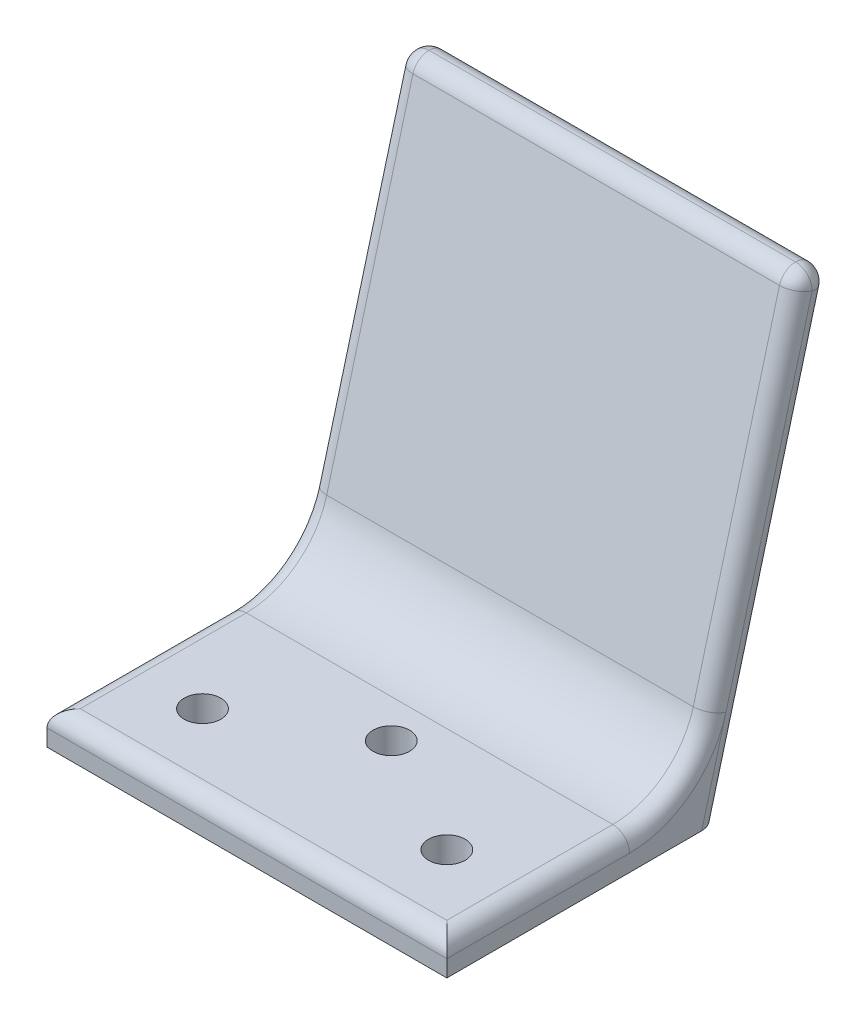
ISO-10303-21;
HEADER;
FILE_DESCRIPTION(('STEP AP214'),'2;1');
FILE_NAME('part.step','',(''),(''),'','','');
FILE_SCHEMA(('AUTOMOTIVE_DESIGN { 1 0 10303 214 1 1 1 1 }'));
ENDSEC;
DATA;
#1=APPLICATION_CONTEXT('core data for automotive mechanical design processes');
#2=APPLICATION_PROTOCOL_DEFINITION('international standard','automotive_design',2000,#1);
#3=PRODUCT_CONTEXT('',#1,'mechanical');
#4=PRODUCT('Part','Part','',(#3));
#5=PRODUCT_RELATED_PRODUCT_CATEGORY('part','',(#4));
#6=PRODUCT_DEFINITION_FORMATION('','',#4);
#7=PRODUCT_DEFINITION_CONTEXT('part definition',#1,'design');
#8=PRODUCT_DEFINITION('design','',#6,#7);
#9=PRODUCT_DEFINITION_SHAPE('','',#8);
#10=(LENGTH_UNIT() NAMED_UNIT(*) SI_UNIT(.MILLI.,.METRE.));
#11=(NAMED_UNIT(*) PLANE_ANGLE_UNIT() SI_UNIT($,.RADIAN.));
#12=(NAMED_UNIT(*) SI_UNIT($,.STERADIAN.) SOLID_ANGLE_UNIT());
#13=UNCERTAINTY_MEASURE_WITH_UNIT(LENGTH_MEASURE(1.E-05),#10,'distance_accuracy_value','');
#14=(GEOMETRIC_REPRESENTATION_CONTEXT(3) GLOBAL_UNCERTAINTY_ASSIGNED_CONTEXT((#13)) GLOBAL_UNIT_ASSIGNED_CONTEXT((#10,
#11,#12)) REPRESENTATION_CONTEXT('',''));
#15=CARTESIAN_POINT('',(0.,0.,0.));
#16=DIRECTION('',(0.,0.,1.));
#17=DIRECTION('',(1.,0.,0.));
#18=AXIS2_PLACEMENT_3D('',#15,#16,#17);
#19=CARTESIAN_POINT('',(-22.5201435218095,73.9492967096611,17.4042615681988));
#20=DIRECTION('',(0.,1.,0.));
#21=DIRECTION('',(0.,0.,1.));
#22=AXIS2_PLACEMENT_3D('',#19,#20,#21);
#23=PLANE('',#22);
#24=CARTESIAN_POINT('',(6.47985647819113,73.9492967096611,10.4042615681988));
#25=DIRECTION('',(0.,1.,0.));
#26=DIRECTION('',(0.,0.,1.));
#27=AXIS2_PLACEMENT_3D('',#24,#25,#26);
#28=CIRCLE('',#27,1.65);
#29=CARTESIAN_POINT('',(6.47985647819113,73.9492967096611,12.0542615681988));
#30=VERTEX_POINT('',#29);
#31=EDGE_CURVE('E529',#30,#30,#28,.F.);
#32=ORIENTED_EDGE('',*,*,#31,.T.);
#33=EDGE_LOOP('',(#32));
#34=FACE_BOUND('',#33,.T.);
#35=DIRECTION('',(1.,0.,0.));
#36=VECTOR('',#35,1.);
#37=CARTESIAN_POINT('',(-22.5201435218095,73.9492967096611,0.961194941977908));
#38=LINE('',#37,#36);
#39=CARTESIAN_POINT('',(11.9798564781905,73.9492967096611,0.961194941977908));
#40=VERTEX_POINT('',#39);
#41=CARTESIAN_POINT('',(-21.0201435218095,73.9492967096611,0.961194941977908));
#42=VERTEX_POINT('',#41);
#43=EDGE_CURVE('E195',#40,#42,#38,.F.);
#44=ORIENTED_EDGE('',*,*,#43,.T.);
#45=DIRECTION('',(0.,0.,1.));
#46=VECTOR('',#45,1.);
#47=CARTESIAN_POINT('',(-21.0201435218095,73.9492967096611,17.4042615681988));
#48=LINE('',#47,#46);
#49=CARTESIAN_POINT('',(-21.0201435218095,73.9492967096611,15.9042615681988));
#50=VERTEX_POINT('',#49);
#51=EDGE_CURVE('E205',#42,#50,#48,.T.);
#52=ORIENTED_EDGE('',*,*,#51,.T.);
#53=DIRECTION('',(1.,0.,0.));
#54=VECTOR('',#53,1.);
#55=CARTESIAN_POINT('',(-22.5201435218095,73.9492967096611,15.9042615681988));
#56=LINE('',#55,#54);
#57=CARTESIAN_POINT('',(11.9798564781905,73.9492967096611,15.9042615681988));
#58=VERTEX_POINT('',#57);
#59=EDGE_CURVE('E199',#50,#58,#56,.T.);
#60=ORIENTED_EDGE('',*,*,#59,.T.);
#61=DIRECTION('',(0.,0.,1.));
#62=VECTOR('',#61,1.);
#63=CARTESIAN_POINT('',(11.9798564781905,73.9492967096611,17.4042615681988));
#64=LINE('',#63,#62);
#65=EDGE_CURVE('E202',#58,#40,#64,.F.);
#66=ORIENTED_EDGE('',*,*,#65,.T.);
#67=EDGE_LOOP('',(#44,#52,#60,#66));
#68=FACE_BOUND('',#67,.T.);
#69=CARTESIAN_POINT('',(-4.52014352180916,73.9492967096611,4.40426156819883));
#70=DIRECTION('',(0.,1.,0.));
#71=DIRECTION('',(0.,0.,1.));
#72=AXIS2_PLACEMENT_3D('',#69,#70,#71);
#73=CIRCLE('',#72,1.65);
#74=CARTESIAN_POINT('',(-4.52014352180916,73.9492967096611,6.05426156819883));
#75=VERTEX_POINT('',#74);
#76=EDGE_CURVE('E520',#75,#75,#73,.T.);
#77=ORIENTED_EDGE('',*,*,#76,.F.);
#78=EDGE_LOOP('',(#77));
#79=FACE_BOUND('',#78,.T.);
#80=CARTESIAN_POINT('',(-15.5201435218095,73.9492967096611,10.4042615681988));
#81=DIRECTION('',(0.,1.,0.));
#82=DIRECTION('',(0.,0.,1.));
#83=AXIS2_PLACEMENT_3D('',#80,#81,#82);
#84=CIRCLE('',#83,1.65);
#85=CARTESIAN_POINT('',(-15.5201435218095,73.9492967096611,12.0542615681988));
#86=VERTEX_POINT('',#85);
#87=EDGE_CURVE('E511',#86,#86,#84,.T.);
#88=ORIENTED_EDGE('',*,*,#87,.F.);
#89=EDGE_LOOP('',(#88));
#90=FACE_BOUND('',#89,.T.);
#91=ADVANCED_FACE('F52',(#34,#68,#79,#90),#23,.T.);
#92=CARTESIAN_POINT('',(-22.5201435218095,70.9492967096611,17.4042615681988));
#93=DIRECTION('',(0.,-1.,0.));
#94=DIRECTION('',(0.,0.,-1.));
#95=AXIS2_PLACEMENT_3D('',#92,#93,#94);
#96=PLANE('',#95);
#97=CARTESIAN_POINT('',(6.47985647819113,70.9492967096611,10.4042615681988));
#98=DIRECTION('',(0.,1.,0.));
#99=DIRECTION('',(0.,0.,1.));
#100=AXIS2_PLACEMENT_3D('',#97,#98,#99);
#101=CIRCLE('',#100,1.65);
#102=CARTESIAN_POINT('',(6.47985647819113,70.9492967096611,12.0542615681988));
#103=VERTEX_POINT('',#102);
#104=EDGE_CURVE('E526',#103,#103,#101,.F.);
#105=ORIENTED_EDGE('',*,*,#104,.F.);
#106=EDGE_LOOP('',(#105));
#107=FACE_BOUND('',#106,.T.);
#108=DIRECTION('',(1.,0.,0.));
#109=VECTOR('',#108,1.);
#110=CARTESIAN_POINT('',(-22.5201435218095,70.9492967096611,-7.09573843180117));
#111=LINE('',#110,#109);
#112=CARTESIAN_POINT('',(-21.0201435218095,70.9492967096611,-7.09573843180117));
#113=VERTEX_POINT('',#112);
#114=CARTESIAN_POINT('',(11.9798564781905,70.9492967096611,-7.09573843180117));
#115=VERTEX_POINT('',#114);
#116=EDGE_CURVE('E173',#113,#115,#111,.T.);
#117=ORIENTED_EDGE('',*,*,#116,.T.);
#118=CARTESIAN_POINT('',(11.9798564781905,70.9492967096611,-5.54282416118605));
#119=DIRECTION('',(0.,-1.,0.));
#120=DIRECTION('',(0.,0.,-1.));
#121=AXIS2_PLACEMENT_3D('',#118,#119,#120);
#122=ELLIPSE('',#121,1.55291427061513,1.5);
#123=CARTESIAN_POINT('',(13.4798564781905,70.9492967096611,-5.54282416118605));
#124=VERTEX_POINT('',#123);
#125=EDGE_CURVE('E255',#115,#124,#122,.T.);
#126=ORIENTED_EDGE('',*,*,#125,.T.);
#127=DIRECTION('',(0.,0.,-1.));
#128=VECTOR('',#127,1.);
#129=CARTESIAN_POINT('',(13.4798564781905,70.9492967096611,17.4042615681988));
#130=LINE('',#129,#128);
#131=CARTESIAN_POINT('',(13.4798564781905,70.9492967096611,17.4042615681988));
#132=VERTEX_POINT('',#131);
#133=EDGE_CURVE('E163',#132,#124,#130,.T.);
#134=ORIENTED_EDGE('',*,*,#133,.F.);
#135=DIRECTION('',(1.,0.,0.));
#136=VECTOR('',#135,1.);
#137=CARTESIAN_POINT('',(-22.5201435218095,70.9492967096611,17.4042615681988));
#138=LINE('',#137,#136);
#139=CARTESIAN_POINT('',(-22.5201435218095,70.9492967096611,17.4042615681988));
#140=VERTEX_POINT('',#139);
#141=EDGE_CURVE('E153',#140,#132,#138,.T.);
#142=ORIENTED_EDGE('',*,*,#141,.F.);
#143=DIRECTION('',(0.,0.,-1.));
#144=VECTOR('',#143,1.);
#145=CARTESIAN_POINT('',(-22.5201435218095,70.9492967096611,17.4042615681988));
#146=LINE('',#145,#144);
#147=CARTESIAN_POINT('',(-22.5201435218095,70.9492967096611,-5.54282416118605));
#148=VERTEX_POINT('',#147);
#149=EDGE_CURVE('E162',#140,#148,#146,.T.);
#150=ORIENTED_EDGE('',*,*,#149,.T.);
#151=CARTESIAN_POINT('',(-21.0201435218095,70.9492967096611,-5.54282416118605));
#152=DIRECTION('',(0.,-1.,0.));
#153=DIRECTION('',(0.,0.,1.));
#154=AXIS2_PLACEMENT_3D('',#151,#152,#153);
#155=ELLIPSE('',#154,1.55291427061513,1.5);
#156=EDGE_CURVE('E252',#148,#113,#155,.T.);
#157=ORIENTED_EDGE('',*,*,#156,.T.);
#158=EDGE_LOOP('',(#117,#126,#134,#142,#150,#157));
#159=FACE_BOUND('',#158,.T.);
#160=CARTESIAN_POINT('',(-4.52014352180916,70.9492967096611,4.40426156819883));
#161=DIRECTION('',(0.,1.,0.));
#162=DIRECTION('',(0.,0.,1.));
#163=AXIS2_PLACEMENT_3D('',#160,#161,#162);
#164=CIRCLE('',#163,1.65);
#165=CARTESIAN_POINT('',(-4.52014352180916,70.9492967096611,6.05426156819883));
#166=VERTEX_POINT('',#165);
#167=EDGE_CURVE('E514',#166,#166,#164,.T.);
#168=ORIENTED_EDGE('',*,*,#167,.T.);
#169=EDGE_LOOP('',(#168));
#170=FACE_BOUND('',#169,.T.);
#171=CARTESIAN_POINT('',(-15.5201435218095,70.9492967096611,10.4042615681988));
#172=DIRECTION('',(0.,1.,0.));
#173=DIRECTION('',(0.,0.,1.));
#174=AXIS2_PLACEMENT_3D('',#171,#172,#173);
#175=CIRCLE('',#174,1.65);
#176=CARTESIAN_POINT('',(-15.5201435218095,70.9492967096611,12.0542615681988));
#177=VERTEX_POINT('',#176);
#178=EDGE_CURVE('E309',#177,#177,#175,.T.);
#179=ORIENTED_EDGE('',*,*,#178,.T.);
#180=EDGE_LOOP('',(#179));
#181=FACE_BOUND('',#180,.T.);
#182=ADVANCED_FACE('F168',(#107,#159,#170,#181),#96,.T.);
#183=CARTESIAN_POINT('',(-22.5201435218095,73.9492967096611,17.4042615681988));
#184=DIRECTION('',(0.,0.,1.));
#185=DIRECTION('',(1.,0.,0.));
#186=AXIS2_PLACEMENT_3D('',#183,#184,#185);
#187=PLANE('',#186);
#188=DIRECTION('',(0.,-1.,0.));
#189=VECTOR('',#188,1.);
#190=CARTESIAN_POINT('',(13.4798564781905,73.9492967096611,17.4042615681988));
#191=LINE('',#190,#189);
#192=CARTESIAN_POINT('',(13.4798564781905,72.4492967096611,17.4042615681988));
#193=VERTEX_POINT('',#192);
#194=EDGE_CURVE('E183',#193,#132,#191,.T.);
#195=ORIENTED_EDGE('',*,*,#194,.F.);
#196=DIRECTION('',(1.,0.,0.));
#197=VECTOR('',#196,1.);
#198=CARTESIAN_POINT('',(-22.5201435218095,72.4492967096611,17.4042615681988));
#199=LINE('',#198,#197);
#200=CARTESIAN_POINT('',(-22.5201435218095,72.4492967096611,17.4042615681988));
#201=VERTEX_POINT('',#200);
#202=EDGE_CURVE('E156',#193,#201,#199,.F.);
#203=ORIENTED_EDGE('',*,*,#202,.T.);
#204=DIRECTION('',(0.,-1.,0.));
#205=VECTOR('',#204,1.);
#206=CARTESIAN_POINT('',(-22.5201435218095,73.9492967096611,17.4042615681988));
#207=LINE('',#206,#205);
#208=EDGE_CURVE('E149',#201,#140,#207,.T.);
#209=ORIENTED_EDGE('',*,*,#208,.T.);
#210=ORIENTED_EDGE('',*,*,#141,.T.);
#211=EDGE_LOOP('',(#195,#203,#209,#210));
#212=FACE_BOUND('',#211,.T.);
#213=ADVANCED_FACE('F152',(#212),#187,.T.);
#214=CARTESIAN_POINT('',(-22.5201435218095,73.9492967096611,-4.79375746786429));
#215=DIRECTION('',(0.,0.258819045102521,0.965925826289068));
#216=DIRECTION('',(0.,-0.965925826289068,0.258819045102521));
#217=AXIS2_PLACEMENT_3D('',#214,#215,#216);
#218=PLANE('',#217);
#219=DIRECTION('',(1.,0.,0.));
#220=VECTOR('',#219,1.);
#221=CARTESIAN_POINT('',(-22.5201435218095,108.474558328878,-14.0447734372066));
#222=LINE('',#221,#220);
#223=CARTESIAN_POINT('',(11.9798564781905,108.474558328878,-14.0447734372066));
#224=VERTEX_POINT('',#223);
#225=CARTESIAN_POINT('',(-21.0201435218095,108.474558328878,-14.0447734372066));
#226=VERTEX_POINT('',#225);
#227=EDGE_CURVE('E217',#224,#226,#222,.F.);
#228=ORIENTED_EDGE('',*,*,#227,.T.);
#229=DIRECTION('',(0.,-0.965925826289068,0.258819045102521));
#230=VECTOR('',#229,1.);
#231=CARTESIAN_POINT('',(-21.0201435218095,79.5081538713922,-6.2832487551901));
#232=LINE('',#231,#230);
#233=CARTESIAN_POINT('',(-21.0201435218095,79.5081538713922,-6.2832487551901));
#234=VERTEX_POINT('',#233);
#235=EDGE_CURVE('E225',#226,#234,#232,.T.);
#236=ORIENTED_EDGE('',*,*,#235,.T.);
#237=DIRECTION('',(1.,0.,0.));
#238=VECTOR('',#237,1.);
#239=CARTESIAN_POINT('',(13.4798564781905,79.5081538713922,-6.2832487551901));
#240=LINE('',#239,#238);
#241=CARTESIAN_POINT('',(11.9798564781905,79.5081538713922,-6.2832487551901));
#242=VERTEX_POINT('',#241);
#243=EDGE_CURVE('E190',#234,#242,#240,.T.);
#244=ORIENTED_EDGE('',*,*,#243,.T.);
#245=DIRECTION('',(0.,-0.965925826289068,0.258819045102521));
#246=VECTOR('',#245,1.);
#247=CARTESIAN_POINT('',(11.9798564781905,73.9492967096611,-4.79375746786429));
#248=LINE('',#247,#246);
#249=EDGE_CURVE('E221',#242,#224,#248,.F.);
#250=ORIENTED_EDGE('',*,*,#249,.T.);
#251=EDGE_LOOP('',(#228,#236,#244,#250));
#252=FACE_BOUND('',#251,.T.);
#253=ADVANCED_FACE('F331',(#252),#218,.T.);
#254=CARTESIAN_POINT('',(-22.5201435218095,70.9492967096611,-7.09573843180117));
#255=DIRECTION('',(0.,-0.258819045102521,-0.965925826289068));
#256=DIRECTION('',(0.,0.965925826289068,-0.258819045102521));
#257=AXIS2_PLACEMENT_3D('',#254,#255,#256);
#258=PLANE('',#257);
#259=DIRECTION('',(0.,0.965925826289068,-0.258819045102521));
#260=VECTOR('',#259,1.);
#261=CARTESIAN_POINT('',(-21.0201435218095,109.586329761224,-17.448500235902));
#262=LINE('',#261,#260);
#263=CARTESIAN_POINT('',(-21.0201435218095,107.69810119357,-16.9425509160738));
#264=VERTEX_POINT('',#263);
#265=EDGE_CURVE('E245',#113,#264,#262,.T.);
#266=ORIENTED_EDGE('',*,*,#265,.T.);
#267=DIRECTION('',(1.,0.,0.));
#268=VECTOR('',#267,1.);
#269=CARTESIAN_POINT('',(-22.5201435218095,107.69810119357,-16.9425509160738));
#270=LINE('',#269,#268);
#271=CARTESIAN_POINT('',(11.9798564781905,107.69810119357,-16.9425509160738));
#272=VERTEX_POINT('',#271);
#273=EDGE_CURVE('E295',#264,#272,#270,.T.);
#274=ORIENTED_EDGE('',*,*,#273,.T.);
#275=DIRECTION('',(0.,0.965925826289068,-0.258819045102521));
#276=VECTOR('',#275,1.);
#277=CARTESIAN_POINT('',(11.9798564781905,70.9492967096611,-7.09573843180117));
#278=LINE('',#277,#276);
#279=EDGE_CURVE('E249',#272,#115,#278,.F.);
#280=ORIENTED_EDGE('',*,*,#279,.T.);
#281=ORIENTED_EDGE('',*,*,#116,.F.);
#282=EDGE_LOOP('',(#266,#274,#280,#281));
#283=FACE_BOUND('',#282,.T.);
#284=ADVANCED_FACE('F398',(#283),#258,.T.);
#285=CARTESIAN_POINT('',(-22.5201435218095,0.,0.));
#286=DIRECTION('',(1.,0.,0.));
#287=DIRECTION('',(0.,0.,-1.));
#288=AXIS2_PLACEMENT_3D('',#285,#286,#287);
#289=PLANE('',#288);
#290=ORIENTED_EDGE('',*,*,#208,.F.);
#291=DIRECTION('',(0.,0.,1.));
#292=VECTOR('',#291,1.);
#293=CARTESIAN_POINT('',(-22.5201435218095,72.4492967096611,0.961194941977907));
#294=LINE('',#293,#292);
#295=CARTESIAN_POINT('',(-22.5201435218095,72.4492967096611,0.961194941977908));
#296=VERTEX_POINT('',#295);
#297=EDGE_CURVE('E214',#201,#296,#294,.F.);
#298=ORIENTED_EDGE('',*,*,#297,.T.);
#299=CARTESIAN_POINT('',(-22.5201435218095,81.4492967096611,0.961194941977908));
#300=DIRECTION('',(1.,0.,0.));
#301=DIRECTION('',(0.,0.,-1.));
#302=AXIS2_PLACEMENT_3D('',#299,#300,#301);
#303=CIRCLE('',#302,9.);
#304=CARTESIAN_POINT('',(-22.5201435218095,79.1199253037384,-7.73213749462371));
#305=VERTEX_POINT('',#304);
#306=EDGE_CURVE('E209',#296,#305,#303,.T.);
#307=ORIENTED_EDGE('',*,*,#306,.T.);
#308=DIRECTION('',(0.,0.965925826289068,-0.258819045102521));
#309=VECTOR('',#308,1.);
#310=CARTESIAN_POINT('',(-22.5201435218095,71.3375252773149,-5.64684969236757));
#311=LINE('',#310,#309);
#312=EDGE_CURVE('E178',#305,#148,#311,.F.);
#313=ORIENTED_EDGE('',*,*,#312,.T.);
#314=ORIENTED_EDGE('',*,*,#149,.F.);
#315=EDGE_LOOP('',(#290,#298,#307,#313,#314));
#316=FACE_BOUND('',#315,.T.);
#317=ADVANCED_FACE('F175',(#316),#289,.F.);
#318=CARTESIAN_POINT('',(13.4798564781905,0.,0.));
#319=DIRECTION('',(1.,0.,0.));
#320=DIRECTION('',(0.,0.,-1.));
#321=AXIS2_PLACEMENT_3D('',#318,#319,#320);
#322=PLANE('',#321);
#323=ORIENTED_EDGE('',*,*,#133,.T.);
#324=DIRECTION('',(0.,0.965925826289068,-0.258819045102521));
#325=VECTOR('',#324,1.);
#326=CARTESIAN_POINT('',(13.4798564781905,3.36699564893095,12.5657988306736));
#327=LINE('',#326,#325);
#328=CARTESIAN_POINT('',(13.4798564781905,79.1199253037384,-7.73213749462371));
#329=VERTEX_POINT('',#328);
#330=EDGE_CURVE('E236',#124,#329,#327,.T.);
#331=ORIENTED_EDGE('',*,*,#330,.T.);
#332=CARTESIAN_POINT('',(13.4798564781905,81.4492967096611,0.961194941977908));
#333=DIRECTION('',(1.,0.,0.));
#334=DIRECTION('',(0.,0.,-1.));
#335=AXIS2_PLACEMENT_3D('',#332,#333,#334);
#336=CIRCLE('',#335,9.);
#337=CARTESIAN_POINT('',(13.4798564781905,72.4492967096611,0.961194941977908));
#338=VERTEX_POINT('',#337);
#339=EDGE_CURVE('E233',#329,#338,#336,.F.);
#340=ORIENTED_EDGE('',*,*,#339,.T.);
#341=DIRECTION('',(0.,0.,1.));
#342=VECTOR('',#341,1.);
#343=CARTESIAN_POINT('',(13.4798564781905,72.4492967096611,0.));
#344=LINE('',#343,#342);
#345=EDGE_CURVE('E230',#338,#193,#344,.T.);
#346=ORIENTED_EDGE('',*,*,#345,.T.);
#347=ORIENTED_EDGE('',*,*,#194,.T.);
#348=EDGE_LOOP('',(#323,#331,#340,#346,#347));
#349=FACE_BOUND('',#348,.T.);
#350=ADVANCED_FACE('F395',(#349),#322,.T.);
#351=CARTESIAN_POINT('',(-22.5201435218095,81.4492967096611,0.961194941977908));
#352=DIRECTION('',(-1.,0.,0.));
#353=DIRECTION('',(0.,0.,1.));
#354=AXIS2_PLACEMENT_3D('',#351,#352,#353);
#355=CYLINDRICAL_SURFACE('',#354,7.5);
#356=ORIENTED_EDGE('',*,*,#43,.F.);
#357=CARTESIAN_POINT('',(11.9798564781905,81.4492967096611,0.961194941977908));
#358=DIRECTION('',(1.,0.,0.));
#359=DIRECTION('',(0.,0.,-1.));
#360=AXIS2_PLACEMENT_3D('',#357,#358,#359);
#361=CIRCLE('',#360,7.5);
#362=EDGE_CURVE('E242',#40,#242,#361,.T.);
#363=ORIENTED_EDGE('',*,*,#362,.T.);
#364=ORIENTED_EDGE('',*,*,#243,.F.);
#365=CARTESIAN_POINT('',(-21.0201435218095,81.4492967096611,0.961194941977908));
#366=DIRECTION('',(1.,0.,0.));
#367=DIRECTION('',(0.,0.,-1.));
#368=AXIS2_PLACEMENT_3D('',#365,#366,#367);
#369=CIRCLE('',#368,7.5);
#370=EDGE_CURVE('E239',#234,#42,#369,.F.);
#371=ORIENTED_EDGE('',*,*,#370,.T.);
#372=EDGE_LOOP('',(#356,#363,#364,#371));
#373=FACE_BOUND('',#372,.T.);
#374=ADVANCED_FACE('F358',(#373),#355,.F.);
#375=CARTESIAN_POINT('',(11.9798564781905,3.36699564893095,12.5657988306736));
#376=DIRECTION('',(0.,0.965925826289068,-0.258819045102521));
#377=DIRECTION('',(0.,0.258819045102521,0.965925826289068));
#378=AXIS2_PLACEMENT_3D('',#375,#376,#377);
#379=CYLINDRICAL_SURFACE('',#378,1.5);
#380=ORIENTED_EDGE('',*,*,#279,.F.);
#381=CARTESIAN_POINT('',(11.9798564781905,108.086329761224,-15.4936621766402));
#382=DIRECTION('',(0.,0.965925826289068,-0.258819045102521));
#383=DIRECTION('',(0.,0.258819045102521,0.965925826289068));
#384=AXIS2_PLACEMENT_3D('',#381,#382,#383);
#385=CIRCLE('',#384,1.5);
#386=CARTESIAN_POINT('',(13.4798564781905,108.086329761224,-15.4936621766402));
#387=VERTEX_POINT('',#386);
#388=EDGE_CURVE('E298',#272,#387,#385,.F.);
#389=ORIENTED_EDGE('',*,*,#388,.T.);
#390=DIRECTION('',(0.,0.965925826289068,-0.258819045102521));
#391=VECTOR('',#390,1.);
#392=CARTESIAN_POINT('',(13.4798564781905,3.36699564893095,12.5657988306736));
#393=LINE('',#392,#391);
#394=EDGE_CURVE('E186',#329,#387,#393,.T.);
#395=ORIENTED_EDGE('',*,*,#394,.F.);
#396=ORIENTED_EDGE('',*,*,#330,.F.);
#397=ORIENTED_EDGE('',*,*,#125,.F.);
#398=EDGE_LOOP('',(#380,#389,#395,#396,#397));
#399=FACE_BOUND('',#398,.T.);
#400=ADVANCED_FACE('F404',(#399),#379,.T.);
#401=CARTESIAN_POINT('',(11.9798564781905,3.36699564893096,12.5657988306736));
#402=DIRECTION('',(0.,-0.965925826289068,0.258819045102521));
#403=DIRECTION('',(0.,-0.258819045102521,-0.965925826289068));
#404=AXIS2_PLACEMENT_3D('',#401,#402,#403);
#405=CYLINDRICAL_SURFACE('',#404,1.5);
#406=ORIENTED_EDGE('',*,*,#394,.T.);
#407=CARTESIAN_POINT('',(11.9798564781905,108.086329761224,-15.4936621766402));
#408=DIRECTION('',(0.,-0.965925826289068,0.258819045102521));
#409=DIRECTION('',(0.,-0.258819045102521,-0.965925826289068));
#410=AXIS2_PLACEMENT_3D('',#407,#408,#409);
#411=CIRCLE('',#410,1.5);
#412=EDGE_CURVE('E11',#387,#224,#411,.T.);
#413=ORIENTED_EDGE('',*,*,#412,.T.);
#414=ORIENTED_EDGE('',*,*,#249,.F.);
#415=CARTESIAN_POINT('',(11.9798564781905,79.1199253037384,-7.7321374946237));
#416=DIRECTION('',(0.,-0.965925826289069,0.258819045102518));
#417=DIRECTION('',(0.,-0.258819045102518,-0.965925826289069));
#418=AXIS2_PLACEMENT_3D('',#415,#416,#417);
#419=CIRCLE('',#418,1.5);
#420=EDGE_CURVE('E282',#329,#242,#419,.T.);
#421=ORIENTED_EDGE('',*,*,#420,.F.);
#422=EDGE_LOOP('',(#406,#413,#414,#421));
#423=FACE_BOUND('',#422,.T.);
#424=ADVANCED_FACE('F327',(#423),#405,.T.);
#425=CARTESIAN_POINT('',(-21.0201435218095,71.3375252773149,-5.64684969236757));
#426=DIRECTION('',(0.,-0.965925826289068,0.258819045102521));
#427=DIRECTION('',(0.,-0.258819045102521,-0.965925826289068));
#428=AXIS2_PLACEMENT_3D('',#425,#426,#427);
#429=CYLINDRICAL_SURFACE('',#428,1.5);
#430=DIRECTION('',(0.,0.965925826289068,-0.258819045102521));
#431=VECTOR('',#430,1.);
#432=CARTESIAN_POINT('',(-22.5201435218095,71.3375252773149,-5.64684969236757));
#433=LINE('',#432,#431);
#434=CARTESIAN_POINT('',(-22.5201435218095,108.086329761224,-15.4936621766402));
#435=VERTEX_POINT('',#434);
#436=EDGE_CURVE('E279',#435,#305,#433,.F.);
#437=ORIENTED_EDGE('',*,*,#436,.F.);
#438=CARTESIAN_POINT('',(-21.0201435218095,108.086329761224,-15.4936621766402));
#439=DIRECTION('',(0.,-0.965925826289068,0.258819045102521));
#440=DIRECTION('',(0.,-0.258819045102521,-0.965925826289068));
#441=AXIS2_PLACEMENT_3D('',#438,#439,#440);
#442=CIRCLE('',#441,1.5);
#443=EDGE_CURVE('E292',#435,#264,#442,.T.);
#444=ORIENTED_EDGE('',*,*,#443,.T.);
#445=ORIENTED_EDGE('',*,*,#265,.F.);
#446=ORIENTED_EDGE('',*,*,#156,.F.);
#447=ORIENTED_EDGE('',*,*,#312,.F.);
#448=EDGE_LOOP('',(#437,#444,#445,#446,#447));
#449=FACE_BOUND('',#448,.T.);
#450=ADVANCED_FACE('F349',(#449),#429,.T.);
#451=CARTESIAN_POINT('',(-22.5201435218095,108.086329761224,-15.4936621766402));
#452=DIRECTION('',(1.,0.,0.));
#453=DIRECTION('',(0.,0.,-1.));
#454=AXIS2_PLACEMENT_3D('',#451,#452,#453);
#455=CYLINDRICAL_SURFACE('',#454,1.5);
#456=DIRECTION('',(1.,0.,0.));
#457=VECTOR('',#456,1.);
#458=CARTESIAN_POINT('',(-22.5201435218095,109.586329761224,-15.4936621766402));
#459=LINE('',#458,#457);
#460=CARTESIAN_POINT('',(-21.0201435218095,109.586329761224,-15.4936621766402));
#461=VERTEX_POINT('',#460);
#462=CARTESIAN_POINT('',(11.9798564781905,109.586329761224,-15.4936621766402));
#463=VERTEX_POINT('',#462);
#464=EDGE_CURVE('E75',#461,#463,#459,.T.);
#465=ORIENTED_EDGE('',*,*,#464,.F.);
#466=CARTESIAN_POINT('',(-21.0201435218095,108.086329761224,-15.4936621766402));
#467=DIRECTION('',(1.,0.,0.));
#468=DIRECTION('',(0.,0.,-1.));
#469=AXIS2_PLACEMENT_3D('',#466,#467,#468);
#470=CIRCLE('',#469,1.5);
#471=EDGE_CURVE('E62',#461,#226,#470,.T.);
#472=ORIENTED_EDGE('',*,*,#471,.T.);
#473=ORIENTED_EDGE('',*,*,#227,.F.);
#474=CARTESIAN_POINT('',(11.9798564781905,108.086329761224,-15.4936621766402));
#475=DIRECTION('',(1.,0.,0.));
#476=DIRECTION('',(0.,0.,-1.));
#477=AXIS2_PLACEMENT_3D('',#474,#475,#476);
#478=CIRCLE('',#477,1.5);
#479=EDGE_CURVE('E70',#224,#463,#478,.F.);
#480=ORIENTED_EDGE('',*,*,#479,.T.);
#481=EDGE_LOOP('',(#465,#472,#473,#480));
#482=FACE_BOUND('',#481,.T.);
#483=ADVANCED_FACE('F334',(#482),#455,.T.);
#484=CARTESIAN_POINT('',(11.9798564781905,81.4492967096611,0.961194941977908));
#485=DIRECTION('',(1.,0.,0.));
#486=DIRECTION('',(0.,0.,-1.));
#487=AXIS2_PLACEMENT_3D('',#484,#485,#486);
#488=TOROIDAL_SURFACE('',#487,9.,1.5);
#489=ORIENTED_EDGE('',*,*,#420,.T.);
#490=ORIENTED_EDGE('',*,*,#362,.F.);
#491=CARTESIAN_POINT('',(11.9798564781905,72.4492967096611,0.961194941977908));
#492=DIRECTION('',(0.,0.,1.));
#493=DIRECTION('',(1.,0.,0.));
#494=AXIS2_PLACEMENT_3D('',#491,#492,#493);
#495=CIRCLE('',#494,1.5);
#496=EDGE_CURVE('E275',#338,#40,#495,.T.);
#497=ORIENTED_EDGE('',*,*,#496,.F.);
#498=ORIENTED_EDGE('',*,*,#339,.F.);
#499=EDGE_LOOP('',(#489,#490,#497,#498));
#500=FACE_BOUND('',#499,.T.);
#501=ADVANCED_FACE('F421',(#500),#488,.T.);
#502=CARTESIAN_POINT('',(-21.0201435218095,73.5610681420073,-6.24264620729789));
#503=DIRECTION('',(0.,0.965925826289068,-0.258819045102521));
#504=DIRECTION('',(0.,0.258819045102521,0.965925826289068));
#505=AXIS2_PLACEMENT_3D('',#502,#503,#504);
#506=CYLINDRICAL_SURFACE('',#505,1.5);
#507=ORIENTED_EDGE('',*,*,#235,.F.);
#508=CARTESIAN_POINT('',(-21.0201435218095,108.086329761224,-15.4936621766402));
#509=DIRECTION('',(0.,0.965925826289068,-0.258819045102521));
#510=DIRECTION('',(0.,0.258819045102521,0.965925826289068));
#511=AXIS2_PLACEMENT_3D('',#508,#509,#510);
#512=CIRCLE('',#511,1.5);
#513=EDGE_CURVE('E260',#226,#435,#512,.F.);
#514=ORIENTED_EDGE('',*,*,#513,.T.);
#515=ORIENTED_EDGE('',*,*,#436,.T.);
#516=CARTESIAN_POINT('',(-21.0201435218095,79.1199253037384,-7.7321374946237));
#517=DIRECTION('',(0.,-0.965925826289069,0.258819045102517));
#518=DIRECTION('',(0.,-0.258819045102517,-0.965925826289069));
#519=AXIS2_PLACEMENT_3D('',#516,#517,#518);
#520=CIRCLE('',#519,1.5);
#521=EDGE_CURVE('E271',#234,#305,#520,.T.);
#522=ORIENTED_EDGE('',*,*,#521,.F.);
#523=EDGE_LOOP('',(#507,#514,#515,#522));
#524=FACE_BOUND('',#523,.T.);
#525=ADVANCED_FACE('F347',(#524),#506,.T.);
#526=CARTESIAN_POINT('',(11.9798564781905,72.4492967096611,0.));
#527=DIRECTION('',(0.,0.,1.));
#528=DIRECTION('',(1.,0.,0.));
#529=AXIS2_PLACEMENT_3D('',#526,#527,#528);
#530=CYLINDRICAL_SURFACE('',#529,1.5);
#531=ORIENTED_EDGE('',*,*,#496,.T.);
#532=ORIENTED_EDGE('',*,*,#65,.F.);
#533=CARTESIAN_POINT('',(11.9798564781905,72.4492967096611,15.9042615681988));
#534=DIRECTION('',(0.707106781186547,0.,-0.707106781186547));
#535=DIRECTION('',(0.707106781186547,0.,0.707106781186547));
#536=AXIS2_PLACEMENT_3D('',#533,#534,#535);
#537=ELLIPSE('',#536,2.12132034355964,1.5);
#538=EDGE_CURVE('E267',#193,#58,#537,.F.);
#539=ORIENTED_EDGE('',*,*,#538,.F.);
#540=ORIENTED_EDGE('',*,*,#345,.F.);
#541=EDGE_LOOP('',(#531,#532,#539,#540));
#542=FACE_BOUND('',#541,.T.);
#543=ADVANCED_FACE('F366',(#542),#530,.T.);
#544=CARTESIAN_POINT('',(-21.0201435218095,81.4492967096611,0.961194941977908));
#545=DIRECTION('',(1.,0.,0.));
#546=DIRECTION('',(0.,0.,-1.));
#547=AXIS2_PLACEMENT_3D('',#544,#545,#546);
#548=TOROIDAL_SURFACE('',#547,9.,1.5);
#549=ORIENTED_EDGE('',*,*,#521,.T.);
#550=ORIENTED_EDGE('',*,*,#306,.F.);
#551=CARTESIAN_POINT('',(-21.0201435218095,72.4492967096611,0.961194941977908));
#552=DIRECTION('',(0.,0.,1.));
#553=DIRECTION('',(1.,0.,0.));
#554=AXIS2_PLACEMENT_3D('',#551,#552,#553);
#555=CIRCLE('',#554,1.5);
#556=EDGE_CURVE('E264',#42,#296,#555,.T.);
#557=ORIENTED_EDGE('',*,*,#556,.F.);
#558=ORIENTED_EDGE('',*,*,#370,.F.);
#559=EDGE_LOOP('',(#549,#550,#557,#558));
#560=FACE_BOUND('',#559,.T.);
#561=ADVANCED_FACE('F353',(#560),#548,.T.);
#562=CARTESIAN_POINT('',(-22.5201435218095,72.4492967096611,15.9042615681988));
#563=DIRECTION('',(1.,0.,0.));
#564=DIRECTION('',(0.,0.,-1.));
#565=AXIS2_PLACEMENT_3D('',#562,#563,#564);
#566=CYLINDRICAL_SURFACE('',#565,1.5);
#567=ORIENTED_EDGE('',*,*,#538,.T.);
#568=ORIENTED_EDGE('',*,*,#59,.F.);
#569=CARTESIAN_POINT('',(-21.0201435218095,72.4492967096611,15.9042615681988));
#570=DIRECTION('',(0.707106781186547,0.,0.707106781186547));
#571=DIRECTION('',(0.707106781186547,0.,-0.707106781186547));
#572=AXIS2_PLACEMENT_3D('',#569,#570,#571);
#573=ELLIPSE('',#572,2.12132034355964,1.5);
#574=EDGE_CURVE('E261',#201,#50,#573,.F.);
#575=ORIENTED_EDGE('',*,*,#574,.F.);
#576=ORIENTED_EDGE('',*,*,#202,.F.);
#577=EDGE_LOOP('',(#567,#568,#575,#576));
#578=FACE_BOUND('',#577,.T.);
#579=ADVANCED_FACE('F370',(#578),#566,.T.);
#580=CARTESIAN_POINT('',(-21.0201435218095,72.4492967096611,17.4042615681988));
#581=DIRECTION('',(0.,0.,-1.));
#582=DIRECTION('',(-1.,0.,0.));
#583=AXIS2_PLACEMENT_3D('',#580,#581,#582);
#584=CYLINDRICAL_SURFACE('',#583,1.5);
#585=ORIENTED_EDGE('',*,*,#556,.T.);
#586=ORIENTED_EDGE('',*,*,#297,.F.);
#587=ORIENTED_EDGE('',*,*,#574,.T.);
#588=ORIENTED_EDGE('',*,*,#51,.F.);
#589=EDGE_LOOP('',(#585,#586,#587,#588));
#590=FACE_BOUND('',#589,.T.);
#591=ADVANCED_FACE('F373',(#590),#584,.T.);
#592=CARTESIAN_POINT('',(11.9798564781905,108.086329761224,-15.4936621766402));
#593=DIRECTION('',(0.,0.,1.));
#594=DIRECTION('',(1.,0.,0.));
#595=AXIS2_PLACEMENT_3D('',#592,#593,#594);
#596=SPHERICAL_SURFACE('',#595,1.5);
#597=ORIENTED_EDGE('',*,*,#479,.F.);
#598=ORIENTED_EDGE('',*,*,#412,.F.);
#599=CARTESIAN_POINT('',(11.9798564781905,108.086329761224,-15.4936621766402));
#600=DIRECTION('',(0.,0.,-1.));
#601=DIRECTION('',(-1.,0.,0.));
#602=AXIS2_PLACEMENT_3D('',#599,#600,#601);
#603=CIRCLE('',#602,1.5);
#604=EDGE_CURVE('E56',#463,#387,#603,.T.);
#605=ORIENTED_EDGE('',*,*,#604,.F.);
#606=EDGE_LOOP('',(#597,#598,#605));
#607=FACE_BOUND('',#606,.T.);
#608=ADVANCED_FACE('F54',(#607),#596,.T.);
#609=CARTESIAN_POINT('',(11.9798564781905,108.086329761224,-15.4936621766402));
#610=DIRECTION('',(0.,1.,0.));
#611=DIRECTION('',(0.,0.,1.));
#612=AXIS2_PLACEMENT_3D('',#609,#610,#611);
#613=SPHERICAL_SURFACE('',#612,1.5);
#614=ORIENTED_EDGE('',*,*,#604,.T.);
#615=ORIENTED_EDGE('',*,*,#388,.F.);
#616=CARTESIAN_POINT('',(11.9798564781905,108.086329761224,-15.4936621766402));
#617=DIRECTION('',(-1.,0.,0.));
#618=DIRECTION('',(0.,0.,1.));
#619=AXIS2_PLACEMENT_3D('',#616,#617,#618);
#620=CIRCLE('',#619,1.5);
#621=EDGE_CURVE('E312',#463,#272,#620,.T.);
#622=ORIENTED_EDGE('',*,*,#621,.F.);
#623=EDGE_LOOP('',(#614,#615,#622));
#624=FACE_BOUND('',#623,.T.);
#625=ADVANCED_FACE('F322',(#624),#613,.T.);
#626=CARTESIAN_POINT('',(-22.5201435218095,108.086329761224,-15.4936621766402));
#627=DIRECTION('',(1.,0.,0.));
#628=DIRECTION('',(0.,0.,-1.));
#629=AXIS2_PLACEMENT_3D('',#626,#627,#628);
#630=CYLINDRICAL_SURFACE('',#629,1.5);
#631=ORIENTED_EDGE('',*,*,#621,.T.);
#632=ORIENTED_EDGE('',*,*,#273,.F.);
#633=CARTESIAN_POINT('',(-21.0201435218095,108.086329761224,-15.4936621766402));
#634=DIRECTION('',(-1.,0.,0.));
#635=DIRECTION('',(0.,0.,1.));
#636=AXIS2_PLACEMENT_3D('',#633,#634,#635);
#637=CIRCLE('',#636,1.5);
#638=EDGE_CURVE('E308',#461,#264,#637,.T.);
#639=ORIENTED_EDGE('',*,*,#638,.F.);
#640=ORIENTED_EDGE('',*,*,#464,.T.);
#641=EDGE_LOOP('',(#631,#632,#639,#640));
#642=FACE_BOUND('',#641,.T.);
#643=ADVANCED_FACE('F440',(#642),#630,.T.);
#644=CARTESIAN_POINT('',(-21.0201435218095,108.086329761224,-15.4936621766402));
#645=DIRECTION('',(0.,1.,0.));
#646=DIRECTION('',(0.,0.,1.));
#647=AXIS2_PLACEMENT_3D('',#644,#645,#646);
#648=SPHERICAL_SURFACE('',#647,1.5);
#649=ORIENTED_EDGE('',*,*,#638,.T.);
#650=ORIENTED_EDGE('',*,*,#443,.F.);
#651=CARTESIAN_POINT('',(-21.0201435218095,108.086329761224,-15.4936621766402));
#652=DIRECTION('',(0.,0.,1.));
#653=DIRECTION('',(0.,-1.,0.));
#654=AXIS2_PLACEMENT_3D('',#651,#652,#653);
#655=CIRCLE('',#654,1.5);
#656=EDGE_CURVE('E305',#461,#435,#655,.T.);
#657=ORIENTED_EDGE('',*,*,#656,.F.);
#658=EDGE_LOOP('',(#649,#650,#657));
#659=FACE_BOUND('',#658,.T.);
#660=ADVANCED_FACE('F342',(#659),#648,.T.);
#661=CARTESIAN_POINT('',(-21.0201435218095,108.086329761224,-15.4936621766402));
#662=DIRECTION('',(0.,0.,1.));
#663=DIRECTION('',(1.,0.,0.));
#664=AXIS2_PLACEMENT_3D('',#661,#662,#663);
#665=SPHERICAL_SURFACE('',#664,1.5);
#666=ORIENTED_EDGE('',*,*,#513,.F.);
#667=ORIENTED_EDGE('',*,*,#471,.F.);
#668=ORIENTED_EDGE('',*,*,#656,.T.);
#669=EDGE_LOOP('',(#666,#667,#668));
#670=FACE_BOUND('',#669,.T.);
#671=ADVANCED_FACE('F339',(#670),#665,.T.);
#672=CARTESIAN_POINT('',(6.47985647819113,70.9492967096611,10.4042615681988));
#673=DIRECTION('',(0.,1.,0.));
#674=DIRECTION('',(0.,0.,1.));
#675=AXIS2_PLACEMENT_3D('',#672,#673,#674);
#676=CYLINDRICAL_SURFACE('',#675,1.65);
#677=ORIENTED_EDGE('',*,*,#104,.T.);
#678=EDGE_LOOP('',(#677));
#679=FACE_BOUND('',#678,.T.);
#680=ORIENTED_EDGE('',*,*,#31,.F.);
#681=EDGE_LOOP('',(#680));
#682=FACE_BOUND('',#681,.T.);
#683=ADVANCED_FACE('F437',(#679,#682),#676,.F.);
#684=CARTESIAN_POINT('',(-4.52014352180916,70.9492967096611,4.40426156819883));
#685=DIRECTION('',(0.,1.,0.));
#686=DIRECTION('',(0.,0.,1.));
#687=AXIS2_PLACEMENT_3D('',#684,#685,#686);
#688=CYLINDRICAL_SURFACE('',#687,1.65);
#689=ORIENTED_EDGE('',*,*,#167,.F.);
#690=EDGE_LOOP('',(#689));
#691=FACE_BOUND('',#690,.T.);
#692=ORIENTED_EDGE('',*,*,#76,.T.);
#693=EDGE_LOOP('',(#692));
#694=FACE_BOUND('',#693,.T.);
#695=ADVANCED_FACE('F483',(#691,#694),#688,.F.);
#696=CARTESIAN_POINT('',(-15.5201435218095,70.9492967096611,10.4042615681988));
#697=DIRECTION('',(0.,1.,0.));
#698=DIRECTION('',(0.,0.,1.));
#699=AXIS2_PLACEMENT_3D('',#696,#697,#698);
#700=CYLINDRICAL_SURFACE('',#699,1.65);
#701=ORIENTED_EDGE('',*,*,#178,.F.);
#702=EDGE_LOOP('',(#701));
#703=FACE_BOUND('',#702,.T.);
#704=ORIENTED_EDGE('',*,*,#87,.T.);
#705=EDGE_LOOP('',(#704));
#706=FACE_BOUND('',#705,.T.);
#707=ADVANCED_FACE('F493',(#703,#706),#700,.F.);
#708=CLOSED_SHELL('',(#91,#182,#213,#253,#284,#317,#350,#374,#400,#424,#450,#483,#501,#525,#543,
#561,#579,#591,#608,#625,#643,#660,#671,#683,#695,#707));
#709=MANIFOLD_SOLID_BREP('B2',#708);
#710=ADVANCED_BREP_SHAPE_REPRESENTATION('',(#18,#709),#14);
#711=SHAPE_DEFINITION_REPRESENTATION(#9,#710);
ENDSEC;
END-ISO-10303-21;
